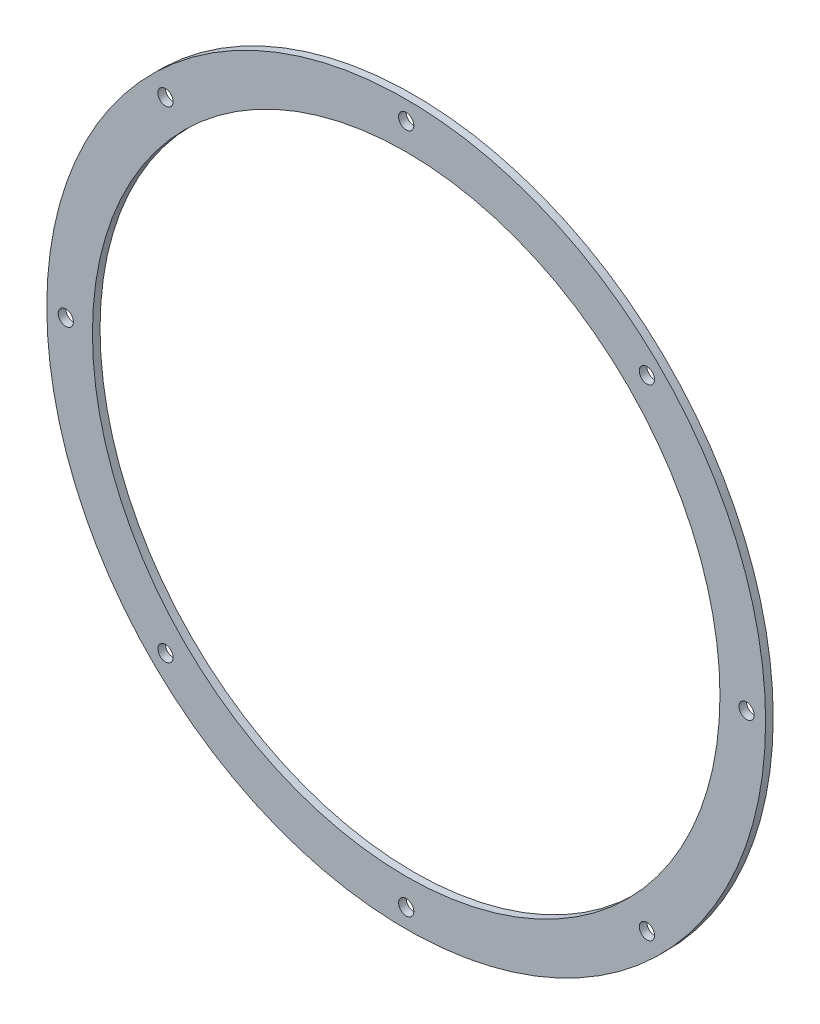
ISO-10303-21;
HEADER;
FILE_DESCRIPTION(('STEP AP214'),'2;1');
FILE_NAME('part.step','',(''),(''),'','','');
FILE_SCHEMA(('AUTOMOTIVE_DESIGN { 1 0 10303 214 1 1 1 1 }'));
ENDSEC;
DATA;
#1=APPLICATION_CONTEXT('core data for automotive mechanical design processes');
#2=APPLICATION_PROTOCOL_DEFINITION('international standard','automotive_design',2000,#1);
#3=PRODUCT_CONTEXT('',#1,'mechanical');
#4=PRODUCT('Part','Part','',(#3));
#5=PRODUCT_RELATED_PRODUCT_CATEGORY('part','',(#4));
#6=PRODUCT_DEFINITION_FORMATION('','',#4);
#7=PRODUCT_DEFINITION_CONTEXT('part definition',#1,'design');
#8=PRODUCT_DEFINITION('design','',#6,#7);
#9=PRODUCT_DEFINITION_SHAPE('','',#8);
#10=(LENGTH_UNIT() NAMED_UNIT(*) SI_UNIT(.MILLI.,.METRE.));
#11=(NAMED_UNIT(*) PLANE_ANGLE_UNIT() SI_UNIT($,.RADIAN.));
#12=(NAMED_UNIT(*) SI_UNIT($,.STERADIAN.) SOLID_ANGLE_UNIT());
#13=UNCERTAINTY_MEASURE_WITH_UNIT(LENGTH_MEASURE(1.E-05),#10,'distance_accuracy_value','');
#14=(GEOMETRIC_REPRESENTATION_CONTEXT(3) GLOBAL_UNCERTAINTY_ASSIGNED_CONTEXT((#13)) GLOBAL_UNIT_ASSIGNED_CONTEXT((#10,
#11,#12)) REPRESENTATION_CONTEXT('',''));
#15=CARTESIAN_POINT('',(0.,0.,0.));
#16=DIRECTION('',(0.,0.,1.));
#17=DIRECTION('',(1.,0.,0.));
#18=AXIS2_PLACEMENT_3D('',#15,#16,#17);
#19=CARTESIAN_POINT('',(0.,0.,2.));
#20=DIRECTION('',(0.,0.,1.));
#21=DIRECTION('',(1.,0.,0.));
#22=AXIS2_PLACEMENT_3D('',#19,#20,#21);
#23=PLANE('',#22);
#24=CARTESIAN_POINT('',(-63.2860569162,-63.2860569162,2.));
#25=DIRECTION('',(0.,0.,1.));
#26=DIRECTION('',(1.,0.,0.));
#27=AXIS2_PLACEMENT_3D('',#24,#25,#26);
#28=CIRCLE('',#27,2.00000000000002);
#29=CARTESIAN_POINT('',(-61.2860569162,-63.2860569162,2.));
#30=VERTEX_POINT('',#29);
#31=EDGE_CURVE('E86',#30,#30,#28,.T.);
#32=ORIENTED_EDGE('',*,*,#31,.F.);
#33=EDGE_LOOP('',(#32));
#34=FACE_BOUND('',#33,.T.);
#35=CARTESIAN_POINT('',(63.2860569162,-63.2860569162,2.));
#36=DIRECTION('',(0.,0.,1.));
#37=DIRECTION('',(1.,0.,0.));
#38=AXIS2_PLACEMENT_3D('',#35,#36,#37);
#39=CIRCLE('',#38,2.00000000000001);
#40=CARTESIAN_POINT('',(65.2860569162,-63.2860569162,2.));
#41=VERTEX_POINT('',#40);
#42=EDGE_CURVE('E74',#41,#41,#39,.T.);
#43=ORIENTED_EDGE('',*,*,#42,.F.);
#44=EDGE_LOOP('',(#43));
#45=FACE_BOUND('',#44,.T.);
#46=CARTESIAN_POINT('',(63.2860569162,63.2860569162,2.));
#47=DIRECTION('',(0.,0.,1.));
#48=DIRECTION('',(1.,0.,0.));
#49=AXIS2_PLACEMENT_3D('',#46,#47,#48);
#50=CIRCLE('',#49,1.99999999999998);
#51=CARTESIAN_POINT('',(65.2860569162,63.2860569162,2.));
#52=VERTEX_POINT('',#51);
#53=EDGE_CURVE('E62',#52,#52,#50,.T.);
#54=ORIENTED_EDGE('',*,*,#53,.F.);
#55=EDGE_LOOP('',(#54));
#56=FACE_BOUND('',#55,.T.);
#57=CARTESIAN_POINT('',(0.,89.5,2.));
#58=DIRECTION('',(0.,0.,1.));
#59=DIRECTION('',(1.,0.,0.));
#60=AXIS2_PLACEMENT_3D('',#57,#58,#59);
#61=CIRCLE('',#60,1.99999999999999);
#62=CARTESIAN_POINT('',(1.99999999999999,89.5,2.));
#63=VERTEX_POINT('',#62);
#64=EDGE_CURVE('E50',#63,#63,#61,.T.);
#65=ORIENTED_EDGE('',*,*,#64,.F.);
#66=EDGE_LOOP('',(#65));
#67=FACE_BOUND('',#66,.T.);
#68=CARTESIAN_POINT('',(0.,0.,2.));
#69=DIRECTION('',(0.,0.,1.));
#70=DIRECTION('',(1.,0.,0.));
#71=AXIS2_PLACEMENT_3D('',#68,#69,#70);
#72=CIRCLE('',#71,94.4999999999982);
#73=CARTESIAN_POINT('',(94.4999999999982,0.,2.));
#74=VERTEX_POINT('',#73);
#75=EDGE_CURVE('E10',#74,#74,#72,.T.);
#76=ORIENTED_EDGE('',*,*,#75,.T.);
#77=EDGE_LOOP('',(#76));
#78=FACE_BOUND('',#77,.T.);
#79=CARTESIAN_POINT('',(0.,0.,2.));
#80=DIRECTION('',(0.,0.,1.));
#81=DIRECTION('',(1.,0.,0.));
#82=AXIS2_PLACEMENT_3D('',#79,#80,#81);
#83=CIRCLE('',#82,82.5);
#84=CARTESIAN_POINT('',(82.5,0.,2.));
#85=VERTEX_POINT('',#84);
#86=EDGE_CURVE('E45',#85,#85,#83,.T.);
#87=ORIENTED_EDGE('',*,*,#86,.F.);
#88=EDGE_LOOP('',(#87));
#89=FACE_BOUND('',#88,.T.);
#90=CARTESIAN_POINT('',(-63.2860569162,63.2860569162,2.));
#91=DIRECTION('',(0.,0.,1.));
#92=DIRECTION('',(1.,0.,0.));
#93=AXIS2_PLACEMENT_3D('',#90,#91,#92);
#94=CIRCLE('',#93,2.00000000000002);
#95=CARTESIAN_POINT('',(-61.2860569162,63.2860569162,2.));
#96=VERTEX_POINT('',#95);
#97=EDGE_CURVE('E56',#96,#96,#94,.T.);
#98=ORIENTED_EDGE('',*,*,#97,.F.);
#99=EDGE_LOOP('',(#98));
#100=FACE_BOUND('',#99,.T.);
#101=CARTESIAN_POINT('',(89.5,0.,2.));
#102=DIRECTION('',(0.,0.,1.));
#103=DIRECTION('',(1.,0.,0.));
#104=AXIS2_PLACEMENT_3D('',#101,#102,#103);
#105=CIRCLE('',#104,2.);
#106=CARTESIAN_POINT('',(91.5,0.,2.));
#107=VERTEX_POINT('',#106);
#108=EDGE_CURVE('E68',#107,#107,#105,.T.);
#109=ORIENTED_EDGE('',*,*,#108,.F.);
#110=EDGE_LOOP('',(#109));
#111=FACE_BOUND('',#110,.T.);
#112=CARTESIAN_POINT('',(0.,-89.5,2.));
#113=DIRECTION('',(0.,0.,1.));
#114=DIRECTION('',(1.,0.,0.));
#115=AXIS2_PLACEMENT_3D('',#112,#113,#114);
#116=CIRCLE('',#115,1.99999999999999);
#117=CARTESIAN_POINT('',(1.99999999999999,-89.5,2.));
#118=VERTEX_POINT('',#117);
#119=EDGE_CURVE('E80',#118,#118,#116,.T.);
#120=ORIENTED_EDGE('',*,*,#119,.F.);
#121=EDGE_LOOP('',(#120));
#122=FACE_BOUND('',#121,.T.);
#123=CARTESIAN_POINT('',(-89.5,0.,2.));
#124=DIRECTION('',(0.,0.,1.));
#125=DIRECTION('',(1.,0.,0.));
#126=AXIS2_PLACEMENT_3D('',#123,#124,#125);
#127=CIRCLE('',#126,2.);
#128=CARTESIAN_POINT('',(-87.5,0.,2.));
#129=VERTEX_POINT('',#128);
#130=EDGE_CURVE('E92',#129,#129,#127,.T.);
#131=ORIENTED_EDGE('',*,*,#130,.F.);
#132=EDGE_LOOP('',(#131));
#133=FACE_BOUND('',#132,.T.);
#134=ADVANCED_FACE('F34',(#34,#45,#56,#67,#78,#89,#100,#111,#122,#133),#23,.T.);
#135=CARTESIAN_POINT('',(0.,0.,0.));
#136=DIRECTION('',(0.,0.,1.));
#137=DIRECTION('',(1.,0.,0.));
#138=AXIS2_PLACEMENT_3D('',#135,#136,#137);
#139=PLANE('',#138);
#140=CARTESIAN_POINT('',(0.,0.,0.));
#141=DIRECTION('',(0.,0.,1.));
#142=DIRECTION('',(1.,0.,0.));
#143=AXIS2_PLACEMENT_3D('',#140,#141,#142);
#144=CIRCLE('',#143,94.4999999999982);
#145=CARTESIAN_POINT('',(94.4999999999982,0.,0.));
#146=VERTEX_POINT('',#145);
#147=EDGE_CURVE('E38',#146,#146,#144,.T.);
#148=ORIENTED_EDGE('',*,*,#147,.F.);
#149=EDGE_LOOP('',(#148));
#150=FACE_BOUND('',#149,.T.);
#151=CARTESIAN_POINT('',(0.,0.,0.));
#152=DIRECTION('',(0.,0.,1.));
#153=DIRECTION('',(1.,0.,0.));
#154=AXIS2_PLACEMENT_3D('',#151,#152,#153);
#155=CIRCLE('',#154,82.5);
#156=CARTESIAN_POINT('',(82.5,0.,0.));
#157=VERTEX_POINT('',#156);
#158=EDGE_CURVE('E47',#157,#157,#155,.T.);
#159=ORIENTED_EDGE('',*,*,#158,.T.);
#160=EDGE_LOOP('',(#159));
#161=FACE_BOUND('',#160,.T.);
#162=CARTESIAN_POINT('',(0.,89.5,0.));
#163=DIRECTION('',(0.,0.,1.));
#164=DIRECTION('',(1.,0.,0.));
#165=AXIS2_PLACEMENT_3D('',#162,#163,#164);
#166=CIRCLE('',#165,1.99999999999999);
#167=CARTESIAN_POINT('',(1.99999999999999,89.5,0.));
#168=VERTEX_POINT('',#167);
#169=EDGE_CURVE('E53',#168,#168,#166,.T.);
#170=ORIENTED_EDGE('',*,*,#169,.T.);
#171=EDGE_LOOP('',(#170));
#172=FACE_BOUND('',#171,.T.);
#173=CARTESIAN_POINT('',(-63.2860569162,63.2860569162,0.));
#174=DIRECTION('',(0.,0.,1.));
#175=DIRECTION('',(1.,0.,0.));
#176=AXIS2_PLACEMENT_3D('',#173,#174,#175);
#177=CIRCLE('',#176,2.00000000000002);
#178=CARTESIAN_POINT('',(-61.2860569162,63.2860569162,0.));
#179=VERTEX_POINT('',#178);
#180=EDGE_CURVE('E59',#179,#179,#177,.T.);
#181=ORIENTED_EDGE('',*,*,#180,.T.);
#182=EDGE_LOOP('',(#181));
#183=FACE_BOUND('',#182,.T.);
#184=CARTESIAN_POINT('',(63.2860569162,63.2860569162,0.));
#185=DIRECTION('',(0.,0.,1.));
#186=DIRECTION('',(1.,0.,0.));
#187=AXIS2_PLACEMENT_3D('',#184,#185,#186);
#188=CIRCLE('',#187,1.99999999999998);
#189=CARTESIAN_POINT('',(65.2860569162,63.2860569162,0.));
#190=VERTEX_POINT('',#189);
#191=EDGE_CURVE('E65',#190,#190,#188,.T.);
#192=ORIENTED_EDGE('',*,*,#191,.T.);
#193=EDGE_LOOP('',(#192));
#194=FACE_BOUND('',#193,.T.);
#195=CARTESIAN_POINT('',(89.5,0.,0.));
#196=DIRECTION('',(0.,0.,1.));
#197=DIRECTION('',(1.,0.,0.));
#198=AXIS2_PLACEMENT_3D('',#195,#196,#197);
#199=CIRCLE('',#198,2.);
#200=CARTESIAN_POINT('',(91.5,0.,0.));
#201=VERTEX_POINT('',#200);
#202=EDGE_CURVE('E71',#201,#201,#199,.T.);
#203=ORIENTED_EDGE('',*,*,#202,.T.);
#204=EDGE_LOOP('',(#203));
#205=FACE_BOUND('',#204,.T.);
#206=CARTESIAN_POINT('',(63.2860569162,-63.2860569162,0.));
#207=DIRECTION('',(0.,0.,1.));
#208=DIRECTION('',(1.,0.,0.));
#209=AXIS2_PLACEMENT_3D('',#206,#207,#208);
#210=CIRCLE('',#209,2.00000000000001);
#211=CARTESIAN_POINT('',(65.2860569162,-63.2860569162,0.));
#212=VERTEX_POINT('',#211);
#213=EDGE_CURVE('E77',#212,#212,#210,.T.);
#214=ORIENTED_EDGE('',*,*,#213,.T.);
#215=EDGE_LOOP('',(#214));
#216=FACE_BOUND('',#215,.T.);
#217=CARTESIAN_POINT('',(0.,-89.5,0.));
#218=DIRECTION('',(0.,0.,1.));
#219=DIRECTION('',(1.,0.,0.));
#220=AXIS2_PLACEMENT_3D('',#217,#218,#219);
#221=CIRCLE('',#220,1.99999999999999);
#222=CARTESIAN_POINT('',(1.99999999999999,-89.5,0.));
#223=VERTEX_POINT('',#222);
#224=EDGE_CURVE('E83',#223,#223,#221,.T.);
#225=ORIENTED_EDGE('',*,*,#224,.T.);
#226=EDGE_LOOP('',(#225));
#227=FACE_BOUND('',#226,.T.);
#228=CARTESIAN_POINT('',(-63.2860569162,-63.2860569162,0.));
#229=DIRECTION('',(0.,0.,1.));
#230=DIRECTION('',(1.,0.,0.));
#231=AXIS2_PLACEMENT_3D('',#228,#229,#230);
#232=CIRCLE('',#231,2.00000000000002);
#233=CARTESIAN_POINT('',(-61.2860569162,-63.2860569162,0.));
#234=VERTEX_POINT('',#233);
#235=EDGE_CURVE('E89',#234,#234,#232,.T.);
#236=ORIENTED_EDGE('',*,*,#235,.T.);
#237=EDGE_LOOP('',(#236));
#238=FACE_BOUND('',#237,.T.);
#239=CARTESIAN_POINT('',(-89.5,0.,0.));
#240=DIRECTION('',(0.,0.,1.));
#241=DIRECTION('',(1.,0.,0.));
#242=AXIS2_PLACEMENT_3D('',#239,#240,#241);
#243=CIRCLE('',#242,2.);
#244=CARTESIAN_POINT('',(-87.5,0.,0.));
#245=VERTEX_POINT('',#244);
#246=EDGE_CURVE('E95',#245,#245,#243,.T.);
#247=ORIENTED_EDGE('',*,*,#246,.T.);
#248=EDGE_LOOP('',(#247));
#249=FACE_BOUND('',#248,.T.);
#250=ADVANCED_FACE('F105',(#150,#161,#172,#183,#194,#205,#216,#227,#238,#249),#139,.F.);
#251=CARTESIAN_POINT('',(0.,0.,2.));
#252=DIRECTION('',(0.,0.,-1.));
#253=DIRECTION('',(-1.,0.,0.));
#254=AXIS2_PLACEMENT_3D('',#251,#252,#253);
#255=CYLINDRICAL_SURFACE('',#254,94.4999999999982);
#256=ORIENTED_EDGE('',*,*,#75,.F.);
#257=EDGE_LOOP('',(#256));
#258=FACE_BOUND('',#257,.T.);
#259=ORIENTED_EDGE('',*,*,#147,.T.);
#260=EDGE_LOOP('',(#259));
#261=FACE_BOUND('',#260,.T.);
#262=ADVANCED_FACE('F36',(#258,#261),#255,.T.);
#263=CARTESIAN_POINT('',(0.,0.,2.));
#264=DIRECTION('',(0.,0.,-1.));
#265=DIRECTION('',(-1.,0.,0.));
#266=AXIS2_PLACEMENT_3D('',#263,#264,#265);
#267=CYLINDRICAL_SURFACE('',#266,82.5);
#268=ORIENTED_EDGE('',*,*,#86,.T.);
#269=EDGE_LOOP('',(#268));
#270=FACE_BOUND('',#269,.T.);
#271=ORIENTED_EDGE('',*,*,#158,.F.);
#272=EDGE_LOOP('',(#271));
#273=FACE_BOUND('',#272,.T.);
#274=ADVANCED_FACE('F115',(#270,#273),#267,.F.);
#275=CARTESIAN_POINT('',(0.,89.5,2.));
#276=DIRECTION('',(0.,0.,-1.));
#277=DIRECTION('',(-1.,0.,0.));
#278=AXIS2_PLACEMENT_3D('',#275,#276,#277);
#279=CYLINDRICAL_SURFACE('',#278,1.99999999999999);
#280=ORIENTED_EDGE('',*,*,#64,.T.);
#281=EDGE_LOOP('',(#280));
#282=FACE_BOUND('',#281,.T.);
#283=ORIENTED_EDGE('',*,*,#169,.F.);
#284=EDGE_LOOP('',(#283));
#285=FACE_BOUND('',#284,.T.);
#286=ADVANCED_FACE('F118',(#282,#285),#279,.F.);
#287=CARTESIAN_POINT('',(-63.2860569162,63.2860569162,2.));
#288=DIRECTION('',(0.,0.,-1.));
#289=DIRECTION('',(-1.,0.,0.));
#290=AXIS2_PLACEMENT_3D('',#287,#288,#289);
#291=CYLINDRICAL_SURFACE('',#290,2.00000000000002);
#292=ORIENTED_EDGE('',*,*,#97,.T.);
#293=EDGE_LOOP('',(#292));
#294=FACE_BOUND('',#293,.T.);
#295=ORIENTED_EDGE('',*,*,#180,.F.);
#296=EDGE_LOOP('',(#295));
#297=FACE_BOUND('',#296,.T.);
#298=ADVANCED_FACE('F122',(#294,#297),#291,.F.);
#299=CARTESIAN_POINT('',(63.2860569162,63.2860569162,2.));
#300=DIRECTION('',(0.,0.,-1.));
#301=DIRECTION('',(-1.,0.,0.));
#302=AXIS2_PLACEMENT_3D('',#299,#300,#301);
#303=CYLINDRICAL_SURFACE('',#302,1.99999999999998);
#304=ORIENTED_EDGE('',*,*,#53,.T.);
#305=EDGE_LOOP('',(#304));
#306=FACE_BOUND('',#305,.T.);
#307=ORIENTED_EDGE('',*,*,#191,.F.);
#308=EDGE_LOOP('',(#307));
#309=FACE_BOUND('',#308,.T.);
#310=ADVANCED_FACE('F126',(#306,#309),#303,.F.);
#311=CARTESIAN_POINT('',(89.5,0.,2.));
#312=DIRECTION('',(0.,0.,-1.));
#313=DIRECTION('',(-1.,0.,0.));
#314=AXIS2_PLACEMENT_3D('',#311,#312,#313);
#315=CYLINDRICAL_SURFACE('',#314,2.);
#316=ORIENTED_EDGE('',*,*,#108,.T.);
#317=EDGE_LOOP('',(#316));
#318=FACE_BOUND('',#317,.T.);
#319=ORIENTED_EDGE('',*,*,#202,.F.);
#320=EDGE_LOOP('',(#319));
#321=FACE_BOUND('',#320,.T.);
#322=ADVANCED_FACE('F130',(#318,#321),#315,.F.);
#323=CARTESIAN_POINT('',(63.2860569162,-63.2860569162,2.));
#324=DIRECTION('',(0.,0.,-1.));
#325=DIRECTION('',(-1.,0.,0.));
#326=AXIS2_PLACEMENT_3D('',#323,#324,#325);
#327=CYLINDRICAL_SURFACE('',#326,2.00000000000001);
#328=ORIENTED_EDGE('',*,*,#42,.T.);
#329=EDGE_LOOP('',(#328));
#330=FACE_BOUND('',#329,.T.);
#331=ORIENTED_EDGE('',*,*,#213,.F.);
#332=EDGE_LOOP('',(#331));
#333=FACE_BOUND('',#332,.T.);
#334=ADVANCED_FACE('F134',(#330,#333),#327,.F.);
#335=CARTESIAN_POINT('',(0.,-89.5,2.));
#336=DIRECTION('',(0.,0.,-1.));
#337=DIRECTION('',(-1.,0.,0.));
#338=AXIS2_PLACEMENT_3D('',#335,#336,#337);
#339=CYLINDRICAL_SURFACE('',#338,1.99999999999999);
#340=ORIENTED_EDGE('',*,*,#119,.T.);
#341=EDGE_LOOP('',(#340));
#342=FACE_BOUND('',#341,.T.);
#343=ORIENTED_EDGE('',*,*,#224,.F.);
#344=EDGE_LOOP('',(#343));
#345=FACE_BOUND('',#344,.T.);
#346=ADVANCED_FACE('F138',(#342,#345),#339,.F.);
#347=CARTESIAN_POINT('',(-63.2860569162,-63.2860569162,2.));
#348=DIRECTION('',(0.,0.,-1.));
#349=DIRECTION('',(-1.,0.,0.));
#350=AXIS2_PLACEMENT_3D('',#347,#348,#349);
#351=CYLINDRICAL_SURFACE('',#350,2.00000000000002);
#352=ORIENTED_EDGE('',*,*,#31,.T.);
#353=EDGE_LOOP('',(#352));
#354=FACE_BOUND('',#353,.T.);
#355=ORIENTED_EDGE('',*,*,#235,.F.);
#356=EDGE_LOOP('',(#355));
#357=FACE_BOUND('',#356,.T.);
#358=ADVANCED_FACE('F142',(#354,#357),#351,.F.);
#359=CARTESIAN_POINT('',(-89.5,0.,2.));
#360=DIRECTION('',(0.,0.,-1.));
#361=DIRECTION('',(-1.,0.,0.));
#362=AXIS2_PLACEMENT_3D('',#359,#360,#361);
#363=CYLINDRICAL_SURFACE('',#362,2.);
#364=ORIENTED_EDGE('',*,*,#130,.T.);
#365=EDGE_LOOP('',(#364));
#366=FACE_BOUND('',#365,.T.);
#367=ORIENTED_EDGE('',*,*,#246,.F.);
#368=EDGE_LOOP('',(#367));
#369=FACE_BOUND('',#368,.T.);
#370=ADVANCED_FACE('F101',(#366,#369),#363,.F.);
#371=CLOSED_SHELL('',(#134,#250,#262,#274,#286,#298,#310,#322,#334,#346,#358,#370));
#372=MANIFOLD_SOLID_BREP('B2',#371);
#373=ADVANCED_BREP_SHAPE_REPRESENTATION('',(#18,#372),#14);
#374=SHAPE_DEFINITION_REPRESENTATION(#9,#373);
ENDSEC;
END-ISO-10303-21;
